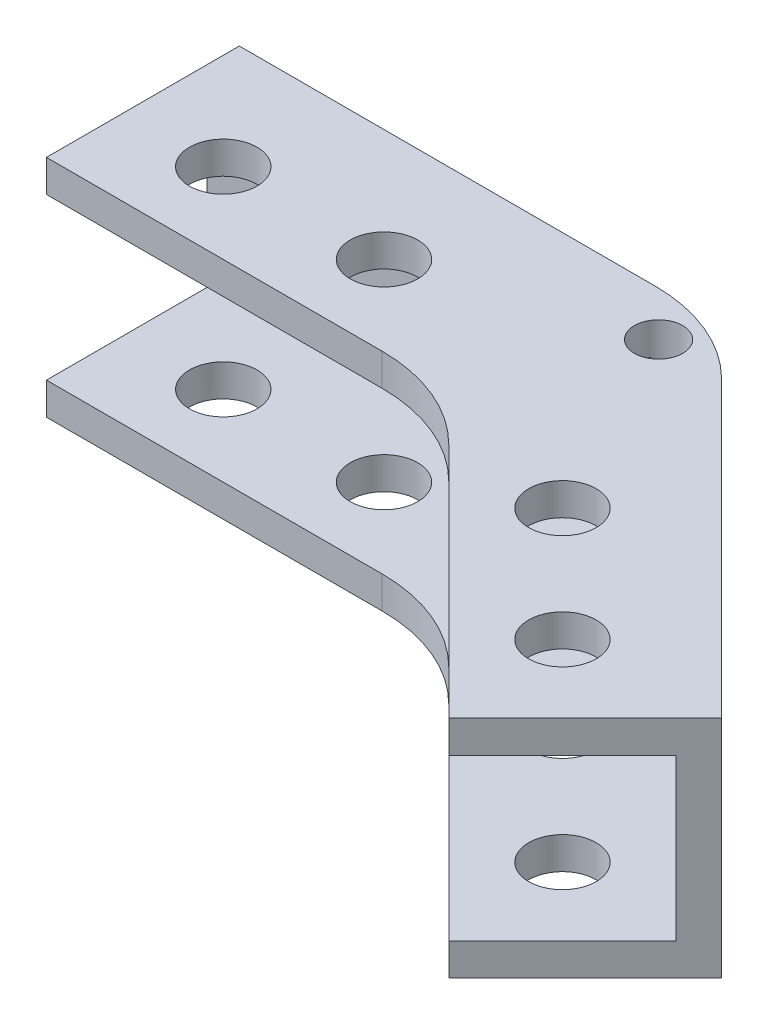
ISO-10303-21;
HEADER;
FILE_DESCRIPTION(('STEP AP214'),'2;1');
FILE_NAME('part.step','',(''),(''),'','','');
FILE_SCHEMA(('AUTOMOTIVE_DESIGN { 1 0 10303 214 1 1 1 1 }'));
ENDSEC;
DATA;
#1=APPLICATION_CONTEXT('core data for automotive mechanical design processes');
#2=APPLICATION_PROTOCOL_DEFINITION('international standard','automotive_design',2000,#1);
#3=PRODUCT_CONTEXT('',#1,'mechanical');
#4=PRODUCT('Part','Part','',(#3));
#5=PRODUCT_RELATED_PRODUCT_CATEGORY('part','',(#4));
#6=PRODUCT_DEFINITION_FORMATION('','',#4);
#7=PRODUCT_DEFINITION_CONTEXT('part definition',#1,'design');
#8=PRODUCT_DEFINITION('design','',#6,#7);
#9=PRODUCT_DEFINITION_SHAPE('','',#8);
#10=(LENGTH_UNIT() NAMED_UNIT(*) SI_UNIT(.MILLI.,.METRE.));
#11=(NAMED_UNIT(*) PLANE_ANGLE_UNIT() SI_UNIT($,.RADIAN.));
#12=(NAMED_UNIT(*) SI_UNIT($,.STERADIAN.) SOLID_ANGLE_UNIT());
#13=UNCERTAINTY_MEASURE_WITH_UNIT(LENGTH_MEASURE(1.E-05),#10,'distance_accuracy_value','');
#14=(GEOMETRIC_REPRESENTATION_CONTEXT(3) GLOBAL_UNCERTAINTY_ASSIGNED_CONTEXT((#13)) GLOBAL_UNIT_ASSIGNED_CONTEXT((#10,
#11,#12)) REPRESENTATION_CONTEXT('',''));
#15=CARTESIAN_POINT('',(0.,0.,0.));
#16=DIRECTION('',(0.,0.,1.));
#17=DIRECTION('',(1.,0.,0.));
#18=AXIS2_PLACEMENT_3D('',#15,#16,#17);
#19=CARTESIAN_POINT('',(1.66776755807594,-0.999999999999999,-7.22836140246614));
#20=DIRECTION('',(0.,1.,0.));
#21=DIRECTION('',(0.,0.,1.));
#22=AXIS2_PLACEMENT_3D('',#19,#20,#21);
#23=CYLINDRICAL_SURFACE('',#22,1.5);
#24=CARTESIAN_POINT('',(1.66776755807594,0.,-7.22836140246614));
#25=DIRECTION('',(0.,-1.,0.));
#26=DIRECTION('',(0.,0.,-1.));
#27=AXIS2_PLACEMENT_3D('',#24,#25,#26);
#28=CIRCLE('',#27,1.5);
#29=CARTESIAN_POINT('',(1.66776755807594,0.,-8.72836140246613));
#30=VERTEX_POINT('',#29);
#31=EDGE_CURVE('E297',#30,#30,#28,.T.);
#32=ORIENTED_EDGE('',*,*,#31,.T.);
#33=EDGE_LOOP('',(#32));
#34=FACE_BOUND('',#33,.T.);
#35=DIRECTION('',(0.,1.,0.));
#36=VECTOR('',#35,1.);
#37=CARTESIAN_POINT('',(3.12295159561377,-0.999999999999999,-6.86443913481123));
#38=LINE('',#37,#36);
#39=CARTESIAN_POINT('',(3.12295159561377,4.,-6.86443913481123));
#40=VERTEX_POINT('',#39);
#41=CARTESIAN_POINT('',(3.12295159561377,2.,-6.86443913481123));
#42=VERTEX_POINT('',#41);
#43=EDGE_CURVE('E283',#40,#42,#38,.F.);
#44=ORIENTED_EDGE('',*,*,#43,.F.);
#45=CARTESIAN_POINT('',(1.66776755807594,4.,-7.22836140246614));
#46=DIRECTION('',(0.,-1.,0.));
#47=DIRECTION('',(0.,0.,-1.));
#48=AXIS2_PLACEMENT_3D('',#45,#46,#47);
#49=CIRCLE('',#48,1.5);
#50=CARTESIAN_POINT('',(0.381465153974948,4.,-7.99999999999999));
#51=VERTEX_POINT('',#50);
#52=EDGE_CURVE('E482',#40,#51,#49,.F.);
#53=ORIENTED_EDGE('',*,*,#52,.T.);
#54=DIRECTION('',(0.,1.,0.));
#55=VECTOR('',#54,1.);
#56=CARTESIAN_POINT('',(0.381465153974948,-0.999999999999999,-7.99999999999999));
#57=LINE('',#56,#55);
#58=CARTESIAN_POINT('',(0.381465153974948,2.,-7.99999999999999));
#59=VERTEX_POINT('',#58);
#60=EDGE_CURVE('E289',#59,#51,#57,.T.);
#61=ORIENTED_EDGE('',*,*,#60,.F.);
#62=CARTESIAN_POINT('',(1.66776755807594,2.,-7.22836140246614));
#63=DIRECTION('',(0.,1.,0.));
#64=DIRECTION('',(0.,0.,1.));
#65=AXIS2_PLACEMENT_3D('',#62,#63,#64);
#66=CIRCLE('',#65,1.5);
#67=EDGE_CURVE('E466',#59,#42,#66,.T.);
#68=ORIENTED_EDGE('',*,*,#67,.T.);
#69=EDGE_LOOP('',(#44,#53,#61,#68));
#70=FACE_BOUND('',#69,.T.);
#71=ADVANCED_FACE('F46',(#34,#70),#23,.F.);
#72=CARTESIAN_POINT('',(1.98739073042501,14.,-7.99999999999999));
#73=DIRECTION('',(0.,0.,-1.));
#74=DIRECTION('',(-1.,0.,0.));
#75=AXIS2_PLACEMENT_3D('',#72,#73,#74);
#76=PLANE('',#75);
#77=DIRECTION('',(0.,1.,0.));
#78=VECTOR('',#77,1.);
#79=CARTESIAN_POINT('',(-4.18418214482879,14.,-7.99999999999999));
#80=LINE('',#79,#78);
#81=CARTESIAN_POINT('',(-4.18418214482879,4.,-7.99999999999999));
#82=VERTEX_POINT('',#81);
#83=CARTESIAN_POINT('',(-4.18418214482879,10.,-7.99999999999999));
#84=VERTEX_POINT('',#83);
#85=EDGE_CURVE('E275',#82,#84,#80,.T.);
#86=ORIENTED_EDGE('',*,*,#85,.T.);
#87=DIRECTION('',(1.,0.,0.));
#88=VECTOR('',#87,1.);
#89=CARTESIAN_POINT('',(1.98739073042501,10.,-7.99999999999999));
#90=LINE('',#89,#88);
#91=CARTESIAN_POINT('',(0.381465153974948,10.,-7.99999999999999));
#92=VERTEX_POINT('',#91);
#93=EDGE_CURVE('E271',#84,#92,#90,.T.);
#94=ORIENTED_EDGE('',*,*,#93,.T.);
#95=CARTESIAN_POINT('',(0.381465153974948,12.,-7.99999999999999));
#96=VERTEX_POINT('',#95);
#97=EDGE_CURVE('E288',#92,#96,#57,.T.);
#98=ORIENTED_EDGE('',*,*,#97,.T.);
#99=DIRECTION('',(-1.,0.,0.));
#100=VECTOR('',#99,1.);
#101=CARTESIAN_POINT('',(1.98739073042501,12.,-7.99999999999999));
#102=LINE('',#101,#100);
#103=CARTESIAN_POINT('',(-27.1841821448288,12.,-7.99999999999999));
#104=VERTEX_POINT('',#103);
#105=EDGE_CURVE('E391',#96,#104,#102,.T.);
#106=ORIENTED_EDGE('',*,*,#105,.T.);
#107=DIRECTION('',(0.,-1.,0.));
#108=VECTOR('',#107,1.);
#109=CARTESIAN_POINT('',(-27.1841821448288,14.,-7.99999999999999));
#110=LINE('',#109,#108);
#111=CARTESIAN_POINT('',(-27.1841821448288,2.,-7.99999999999999));
#112=VERTEX_POINT('',#111);
#113=EDGE_CURVE('E463',#104,#112,#110,.T.);
#114=ORIENTED_EDGE('',*,*,#113,.T.);
#115=DIRECTION('',(1.,0.,0.));
#116=VECTOR('',#115,1.);
#117=CARTESIAN_POINT('',(1.98739073042501,2.,-7.99999999999999));
#118=LINE('',#117,#116);
#119=EDGE_CURVE('E354',#112,#59,#118,.T.);
#120=ORIENTED_EDGE('',*,*,#119,.T.);
#121=ORIENTED_EDGE('',*,*,#60,.T.);
#122=DIRECTION('',(-1.,0.,0.));
#123=VECTOR('',#122,1.);
#124=CARTESIAN_POINT('',(1.98739073042501,4.,-7.99999999999999));
#125=LINE('',#124,#123);
#126=EDGE_CURVE('E264',#51,#82,#125,.T.);
#127=ORIENTED_EDGE('',*,*,#126,.T.);
#128=EDGE_LOOP('',(#86,#94,#98,#106,#114,#120,#121,#127));
#129=FACE_BOUND('',#128,.T.);
#130=ADVANCED_FACE('F563',(#129),#76,.F.);
#131=CARTESIAN_POINT('',(22.6148077283945,14.,12.6274169979696));
#132=DIRECTION('',(0.707106781186548,0.,-0.707106781186547));
#133=DIRECTION('',(-0.707106781186547,0.,-0.707106781186548));
#134=AXIS2_PLACEMENT_3D('',#131,#132,#133);
#135=PLANE('',#134);
#136=DIRECTION('',(0.,-1.,0.));
#137=VECTOR('',#136,1.);
#138=CARTESIAN_POINT('',(6.35135176110393,14.,-3.63603896932106));
#139=LINE('',#138,#137);
#140=CARTESIAN_POINT('',(6.35135176110393,10.,-3.63603896932106));
#141=VERTEX_POINT('',#140);
#142=CARTESIAN_POINT('',(6.35135176110393,4.,-3.63603896932106));
#143=VERTEX_POINT('',#142);
#144=EDGE_CURVE('E226',#141,#143,#139,.T.);
#145=ORIENTED_EDGE('',*,*,#144,.T.);
#146=DIRECTION('',(-0.707106781186547,0.,-0.707106781186548));
#147=VECTOR('',#146,1.);
#148=CARTESIAN_POINT('',(22.6148077283945,3.99999999999999,12.6274169979695));
#149=LINE('',#148,#147);
#150=EDGE_CURVE('E244',#143,#40,#149,.T.);
#151=ORIENTED_EDGE('',*,*,#150,.T.);
#152=ORIENTED_EDGE('',*,*,#43,.T.);
#153=DIRECTION('',(0.707106781186547,0.,0.707106781186548));
#154=VECTOR('',#153,1.);
#155=CARTESIAN_POINT('',(22.6148077283945,2.,12.6274169979696));
#156=LINE('',#155,#154);
#157=CARTESIAN_POINT('',(22.6148077283945,2.,12.6274169979696));
#158=VERTEX_POINT('',#157);
#159=EDGE_CURVE('E358',#42,#158,#156,.T.);
#160=ORIENTED_EDGE('',*,*,#159,.T.);
#161=DIRECTION('',(0.,-1.,0.));
#162=VECTOR('',#161,1.);
#163=CARTESIAN_POINT('',(22.6148077283945,14.,12.6274169979696));
#164=LINE('',#163,#162);
#165=CARTESIAN_POINT('',(22.6148077283945,12.,12.6274169979696));
#166=VERTEX_POINT('',#165);
#167=EDGE_CURVE('E459',#166,#158,#164,.T.);
#168=ORIENTED_EDGE('',*,*,#167,.F.);
#169=DIRECTION('',(-0.707106781186547,0.,-0.707106781186548));
#170=VECTOR('',#169,1.);
#171=CARTESIAN_POINT('',(22.6148077283945,12.,12.6274169979696));
#172=LINE('',#171,#170);
#173=CARTESIAN_POINT('',(3.12295159561377,12.,-6.86443913481123));
#174=VERTEX_POINT('',#173);
#175=EDGE_CURVE('E409',#166,#174,#172,.T.);
#176=ORIENTED_EDGE('',*,*,#175,.T.);
#177=CARTESIAN_POINT('',(3.12295159561377,10.,-6.86443913481123));
#178=VERTEX_POINT('',#177);
#179=EDGE_CURVE('E284',#174,#178,#38,.F.);
#180=ORIENTED_EDGE('',*,*,#179,.T.);
#181=DIRECTION('',(0.707106781186547,0.,0.707106781186548));
#182=VECTOR('',#181,1.);
#183=CARTESIAN_POINT('',(22.6148077283945,10.,12.6274169979696));
#184=LINE('',#183,#182);
#185=EDGE_CURVE('E240',#178,#141,#184,.T.);
#186=ORIENTED_EDGE('',*,*,#185,.T.);
#187=EDGE_LOOP('',(#145,#151,#152,#160,#168,#176,#180,#186));
#188=FACE_BOUND('',#187,.T.);
#189=ADVANCED_FACE('F536',(#188),#135,.F.);
#190=CARTESIAN_POINT('',(-27.1841821448288,14.,-7.99999999999999));
#191=DIRECTION('',(1.,0.,0.));
#192=DIRECTION('',(0.,0.,-1.));
#193=AXIS2_PLACEMENT_3D('',#190,#191,#192);
#194=PLANE('',#193);
#195=DIRECTION('',(0.,0.,1.));
#196=VECTOR('',#195,1.);
#197=CARTESIAN_POINT('',(-27.1841821448288,0.,-7.99999999999999));
#198=LINE('',#197,#196);
#199=CARTESIAN_POINT('',(-27.1841821448288,0.,-9.99999999999999));
#200=VERTEX_POINT('',#199);
#201=CARTESIAN_POINT('',(-27.1841821448288,0.,2.00000000000001));
#202=VERTEX_POINT('',#201);
#203=EDGE_CURVE('E422',#200,#202,#198,.T.);
#204=ORIENTED_EDGE('',*,*,#203,.T.);
#205=DIRECTION('',(0.,-1.,0.));
#206=VECTOR('',#205,1.);
#207=CARTESIAN_POINT('',(-27.1841821448288,2.,2.00000000000001));
#208=LINE('',#207,#206);
#209=CARTESIAN_POINT('',(-27.1841821448288,2.,2.00000000000001));
#210=VERTEX_POINT('',#209);
#211=EDGE_CURVE('E383',#210,#202,#208,.T.);
#212=ORIENTED_EDGE('',*,*,#211,.F.);
#213=DIRECTION('',(0.,0.,-1.));
#214=VECTOR('',#213,1.);
#215=CARTESIAN_POINT('',(-27.1841821448288,2.,-7.99999999999999));
#216=LINE('',#215,#214);
#217=EDGE_CURVE('E373',#210,#112,#216,.T.);
#218=ORIENTED_EDGE('',*,*,#217,.T.);
#219=ORIENTED_EDGE('',*,*,#113,.F.);
#220=DIRECTION('',(0.,0.,1.));
#221=VECTOR('',#220,1.);
#222=CARTESIAN_POINT('',(-27.1841821448288,12.,-7.99999999999999));
#223=LINE('',#222,#221);
#224=CARTESIAN_POINT('',(-27.1841821448288,12.,2.00000000000001));
#225=VERTEX_POINT('',#224);
#226=EDGE_CURVE('E394',#104,#225,#223,.T.);
#227=ORIENTED_EDGE('',*,*,#226,.T.);
#228=DIRECTION('',(0.,1.,0.));
#229=VECTOR('',#228,1.);
#230=CARTESIAN_POINT('',(-27.1841821448288,12.,2.00000000000001));
#231=LINE('',#230,#229);
#232=CARTESIAN_POINT('',(-27.1841821448288,14.,2.00000000000001));
#233=VERTEX_POINT('',#232);
#234=EDGE_CURVE('E413',#225,#233,#231,.T.);
#235=ORIENTED_EDGE('',*,*,#234,.T.);
#236=DIRECTION('',(0.,0.,1.));
#237=VECTOR('',#236,1.);
#238=CARTESIAN_POINT('',(-27.1841821448288,14.,-7.99999999999999));
#239=LINE('',#238,#237);
#240=CARTESIAN_POINT('',(-27.1841821448288,14.,-9.99999999999999));
#241=VERTEX_POINT('',#240);
#242=EDGE_CURVE('E426',#241,#233,#239,.T.);
#243=ORIENTED_EDGE('',*,*,#242,.F.);
#244=DIRECTION('',(0.,-1.,0.));
#245=VECTOR('',#244,1.);
#246=CARTESIAN_POINT('',(-27.1841821448288,14.,-9.99999999999999));
#247=LINE('',#246,#245);
#248=EDGE_CURVE('E440',#241,#200,#247,.T.);
#249=ORIENTED_EDGE('',*,*,#248,.T.);
#250=EDGE_LOOP('',(#204,#212,#218,#219,#227,#235,#243,#249));
#251=FACE_BOUND('',#250,.T.);
#252=ADVANCED_FACE('F603',(#251),#194,.F.);
#253=CARTESIAN_POINT('',(24.0290212907676,14.,11.2132034355965));
#254=DIRECTION('',(-0.707106781186546,0.,-0.707106781186549));
#255=DIRECTION('',(-0.707106781186549,0.,0.707106781186546));
#256=AXIS2_PLACEMENT_3D('',#253,#254,#255);
#257=PLANE('',#256);
#258=DIRECTION('',(0.707106781186549,0.,-0.707106781186546));
#259=VECTOR('',#258,1.);
#260=CARTESIAN_POINT('',(24.0290212907676,0.,11.2132034355965));
#261=LINE('',#260,#259);
#262=CARTESIAN_POINT('',(15.543739916529,0.,19.698484809835));
#263=VERTEX_POINT('',#262);
#264=CARTESIAN_POINT('',(24.0290212907676,0.,11.2132034355965));
#265=VERTEX_POINT('',#264);
#266=EDGE_CURVE('E444',#263,#265,#261,.T.);
#267=ORIENTED_EDGE('',*,*,#266,.T.);
#268=DIRECTION('',(0.,-1.,0.));
#269=VECTOR('',#268,1.);
#270=CARTESIAN_POINT('',(24.0290212907676,14.,11.2132034355965));
#271=LINE('',#270,#269);
#272=CARTESIAN_POINT('',(24.0290212907676,14.,11.2132034355965));
#273=VERTEX_POINT('',#272);
#274=EDGE_CURVE('E455',#273,#265,#271,.T.);
#275=ORIENTED_EDGE('',*,*,#274,.F.);
#276=DIRECTION('',(0.707106781186549,0.,-0.707106781186546));
#277=VECTOR('',#276,1.);
#278=CARTESIAN_POINT('',(24.0290212907676,14.,11.2132034355965));
#279=LINE('',#278,#277);
#280=CARTESIAN_POINT('',(15.543739916529,14.,19.698484809835));
#281=VERTEX_POINT('',#280);
#282=EDGE_CURVE('E429',#281,#273,#279,.T.);
#283=ORIENTED_EDGE('',*,*,#282,.F.);
#284=DIRECTION('',(0.,1.,0.));
#285=VECTOR('',#284,1.);
#286=CARTESIAN_POINT('',(15.543739916529,12.,19.698484809835));
#287=LINE('',#286,#285);
#288=CARTESIAN_POINT('',(15.543739916529,12.,19.698484809835));
#289=VERTEX_POINT('',#288);
#290=EDGE_CURVE('E418',#289,#281,#287,.T.);
#291=ORIENTED_EDGE('',*,*,#290,.F.);
#292=DIRECTION('',(0.707106781186548,0.,-0.707106781186547));
#293=VECTOR('',#292,1.);
#294=CARTESIAN_POINT('',(15.543739916529,12.,19.698484809835));
#295=LINE('',#294,#293);
#296=EDGE_CURVE('E406',#289,#166,#295,.T.);
#297=ORIENTED_EDGE('',*,*,#296,.T.);
#298=ORIENTED_EDGE('',*,*,#167,.T.);
#299=DIRECTION('',(-0.707106781186548,0.,0.707106781186547));
#300=VECTOR('',#299,1.);
#301=CARTESIAN_POINT('',(15.543739916529,2.,19.698484809835));
#302=LINE('',#301,#300);
#303=CARTESIAN_POINT('',(15.543739916529,2.,19.698484809835));
#304=VERTEX_POINT('',#303);
#305=EDGE_CURVE('E362',#158,#304,#302,.T.);
#306=ORIENTED_EDGE('',*,*,#305,.T.);
#307=DIRECTION('',(0.,-1.,0.));
#308=VECTOR('',#307,1.);
#309=CARTESIAN_POINT('',(15.543739916529,2.,19.698484809835));
#310=LINE('',#309,#308);
#311=EDGE_CURVE('E377',#304,#263,#310,.T.);
#312=ORIENTED_EDGE('',*,*,#311,.T.);
#313=EDGE_LOOP('',(#267,#275,#283,#291,#297,#298,#306,#312));
#314=FACE_BOUND('',#313,.T.);
#315=ADVANCED_FACE('F548',(#314),#257,.F.);
#316=CARTESIAN_POINT('',(2.81581785517121,14.,-9.99999999999999));
#317=DIRECTION('',(-0.707106781186549,0.,0.707106781186547));
#318=DIRECTION('',(0.707106781186546,0.,0.707106781186549));
#319=AXIS2_PLACEMENT_3D('',#316,#317,#318);
#320=PLANE('',#319);
#321=DIRECTION('',(-0.707106781186546,0.,-0.707106781186549));
#322=VECTOR('',#321,1.);
#323=CARTESIAN_POINT('',(2.81581785517121,0.,-9.99999999999999));
#324=LINE('',#323,#322);
#325=CARTESIAN_POINT('',(5.74475004330574,0.,-7.07106781186546));
#326=VERTEX_POINT('',#325);
#327=EDGE_CURVE('E447',#265,#326,#324,.T.);
#328=ORIENTED_EDGE('',*,*,#327,.T.);
#329=DIRECTION('',(0.,-1.,0.));
#330=VECTOR('',#329,1.);
#331=CARTESIAN_POINT('',(5.74475004330574,14.,-7.07106781186546));
#332=LINE('',#331,#330);
#333=CARTESIAN_POINT('',(5.74475004330574,4.,-7.07106781186546));
#334=VERTEX_POINT('',#333);
#335=EDGE_CURVE('E502',#326,#334,#332,.F.);
#336=ORIENTED_EDGE('',*,*,#335,.T.);
#337=DIRECTION('',(-0.707106781186547,0.,-0.707106781186549));
#338=VECTOR('',#337,1.);
#339=CARTESIAN_POINT('',(2.81581785517121,4.,-9.99999999999999));
#340=LINE('',#339,#338);
#341=CARTESIAN_POINT('',(7.76556532347703,4.,-5.05025253169415));
#342=VERTEX_POINT('',#341);
#343=EDGE_CURVE('E229',#342,#334,#340,.T.);
#344=ORIENTED_EDGE('',*,*,#343,.F.);
#345=DIRECTION('',(0.,-1.,0.));
#346=VECTOR('',#345,1.);
#347=CARTESIAN_POINT('',(7.76556532347703,10.,-5.05025253169415));
#348=LINE('',#347,#346);
#349=CARTESIAN_POINT('',(7.76556532347703,10.,-5.05025253169415));
#350=VERTEX_POINT('',#349);
#351=EDGE_CURVE('E218',#350,#342,#348,.T.);
#352=ORIENTED_EDGE('',*,*,#351,.F.);
#353=DIRECTION('',(0.707106781186547,0.,0.707106781186549));
#354=VECTOR('',#353,1.);
#355=CARTESIAN_POINT('',(2.81581785517121,10.,-9.99999999999999));
#356=LINE('',#355,#354);
#357=CARTESIAN_POINT('',(5.74475004330574,10.,-7.07106781186546));
#358=VERTEX_POINT('',#357);
#359=EDGE_CURVE('E206',#358,#350,#356,.T.);
#360=ORIENTED_EDGE('',*,*,#359,.F.);
#361=DIRECTION('',(0.,-1.,0.));
#362=VECTOR('',#361,1.);
#363=CARTESIAN_POINT('',(5.74475004330574,14.,-7.07106781186546));
#364=LINE('',#363,#362);
#365=CARTESIAN_POINT('',(5.74475004330574,14.,-7.07106781186546));
#366=VERTEX_POINT('',#365);
#367=EDGE_CURVE('E499',#358,#366,#364,.F.);
#368=ORIENTED_EDGE('',*,*,#367,.T.);
#369=DIRECTION('',(-0.707106781186546,0.,-0.707106781186549));
#370=VECTOR('',#369,1.);
#371=CARTESIAN_POINT('',(2.81581785517121,14.,-9.99999999999999));
#372=LINE('',#371,#370);
#373=EDGE_CURVE('E433',#273,#366,#372,.T.);
#374=ORIENTED_EDGE('',*,*,#373,.F.);
#375=ORIENTED_EDGE('',*,*,#274,.T.);
#376=EDGE_LOOP('',(#328,#336,#344,#352,#360,#368,#374,#375));
#377=FACE_BOUND('',#376,.T.);
#378=ADVANCED_FACE('F232',(#377),#320,.F.);
#379=CARTESIAN_POINT('',(-27.1841821448288,14.,-9.99999999999999));
#380=DIRECTION('',(0.,0.,1.));
#381=DIRECTION('',(1.,0.,0.));
#382=AXIS2_PLACEMENT_3D('',#379,#380,#381);
#383=PLANE('',#382);
#384=DIRECTION('',(-1.,0.,0.));
#385=VECTOR('',#384,1.);
#386=CARTESIAN_POINT('',(2.81581785517121,4.,-9.99999999999999));
#387=LINE('',#386,#385);
#388=CARTESIAN_POINT('',(-1.32631776855975,4.,-9.99999999999999));
#389=VERTEX_POINT('',#388);
#390=CARTESIAN_POINT('',(-4.18418214482879,4.,-9.99999999999999));
#391=VERTEX_POINT('',#390);
#392=EDGE_CURVE('E250',#389,#391,#387,.T.);
#393=ORIENTED_EDGE('',*,*,#392,.F.);
#394=DIRECTION('',(0.,-1.,0.));
#395=VECTOR('',#394,1.);
#396=CARTESIAN_POINT('',(-1.32631776855975,14.,-9.99999999999999));
#397=LINE('',#396,#395);
#398=CARTESIAN_POINT('',(-1.32631776855975,0.,-9.99999999999999));
#399=VERTEX_POINT('',#398);
#400=EDGE_CURVE('E492',#389,#399,#397,.T.);
#401=ORIENTED_EDGE('',*,*,#400,.T.);
#402=DIRECTION('',(-1.,0.,0.));
#403=VECTOR('',#402,1.);
#404=CARTESIAN_POINT('',(-27.1841821448288,0.,-9.99999999999999));
#405=LINE('',#404,#403);
#406=EDGE_CURVE('E430',#399,#200,#405,.T.);
#407=ORIENTED_EDGE('',*,*,#406,.T.);
#408=ORIENTED_EDGE('',*,*,#248,.F.);
#409=DIRECTION('',(-1.,0.,0.));
#410=VECTOR('',#409,1.);
#411=CARTESIAN_POINT('',(-27.1841821448288,14.,-9.99999999999999));
#412=LINE('',#411,#410);
#413=CARTESIAN_POINT('',(-1.32631776855975,14.,-9.99999999999999));
#414=VERTEX_POINT('',#413);
#415=EDGE_CURVE('E437',#414,#241,#412,.T.);
#416=ORIENTED_EDGE('',*,*,#415,.F.);
#417=DIRECTION('',(0.,-1.,0.));
#418=VECTOR('',#417,1.);
#419=CARTESIAN_POINT('',(-1.32631776855975,14.,-9.99999999999999));
#420=LINE('',#419,#418);
#421=CARTESIAN_POINT('',(-1.32631776855975,10.,-9.99999999999999));
#422=VERTEX_POINT('',#421);
#423=EDGE_CURVE('E488',#414,#422,#420,.T.);
#424=ORIENTED_EDGE('',*,*,#423,.T.);
#425=DIRECTION('',(1.,0.,0.));
#426=VECTOR('',#425,1.);
#427=CARTESIAN_POINT('',(2.81581785517121,10.,-9.99999999999999));
#428=LINE('',#427,#426);
#429=CARTESIAN_POINT('',(-4.18418214482879,10.,-9.99999999999999));
#430=VERTEX_POINT('',#429);
#431=EDGE_CURVE('E257',#430,#422,#428,.T.);
#432=ORIENTED_EDGE('',*,*,#431,.F.);
#433=DIRECTION('',(0.,1.,0.));
#434=VECTOR('',#433,1.);
#435=CARTESIAN_POINT('',(-4.18418214482879,10.,-9.99999999999999));
#436=LINE('',#435,#434);
#437=EDGE_CURVE('E253',#391,#430,#436,.T.);
#438=ORIENTED_EDGE('',*,*,#437,.F.);
#439=EDGE_LOOP('',(#393,#401,#407,#408,#416,#424,#432,#438));
#440=FACE_BOUND('',#439,.T.);
#441=ADVANCED_FACE('F575',(#440),#383,.F.);
#442=CARTESIAN_POINT('',(0.,14.,0.));
#443=DIRECTION('',(0.,-1.,0.));
#444=DIRECTION('',(0.,0.,-1.));
#445=AXIS2_PLACEMENT_3D('',#442,#443,#444);
#446=PLANE('',#445);
#447=CARTESIAN_POINT('',(1.66776755807594,14.,-7.22836140246614));
#448=DIRECTION('',(0.,1.,0.));
#449=DIRECTION('',(0.,0.,1.));
#450=AXIS2_PLACEMENT_3D('',#447,#448,#449);
#451=CIRCLE('',#450,1.5);
#452=CARTESIAN_POINT('',(1.66776755807594,14.,-5.72836140246614));
#453=VERTEX_POINT('',#452);
#454=EDGE_CURVE('E279',#453,#453,#451,.T.);
#455=ORIENTED_EDGE('',*,*,#454,.F.);
#456=EDGE_LOOP('',(#455));
#457=FACE_BOUND('',#456,.T.);
#458=CARTESIAN_POINT('',(-21.1841821448288,14.,-2.99999999999999));
#459=DIRECTION('',(0.,1.,0.));
#460=DIRECTION('',(0.,0.,1.));
#461=AXIS2_PLACEMENT_3D('',#458,#459,#460);
#462=CIRCLE('',#461,2.1);
#463=CARTESIAN_POINT('',(-21.1841821448288,14.,-0.899999999999994));
#464=VERTEX_POINT('',#463);
#465=EDGE_CURVE('E302',#464,#464,#462,.T.);
#466=ORIENTED_EDGE('',*,*,#465,.F.);
#467=EDGE_LOOP('',(#466));
#468=FACE_BOUND('',#467,.T.);
#469=CARTESIAN_POINT('',(-11.1841821448288,14.,-2.99999999999999));
#470=DIRECTION('',(0.,1.,0.));
#471=DIRECTION('',(0.,0.,1.));
#472=AXIS2_PLACEMENT_3D('',#469,#470,#471);
#473=CIRCLE('',#472,2.1);
#474=CARTESIAN_POINT('',(-11.1841821448288,14.,-0.899999999999994));
#475=VERTEX_POINT('',#474);
#476=EDGE_CURVE('E307',#475,#475,#473,.T.);
#477=ORIENTED_EDGE('',*,*,#476,.F.);
#478=EDGE_LOOP('',(#477));
#479=FACE_BOUND('',#478,.T.);
#480=CARTESIAN_POINT('',(7.765565323477,14.,4.84924240491752));
#481=DIRECTION('',(0.,1.,0.));
#482=DIRECTION('',(0.,0.,1.));
#483=AXIS2_PLACEMENT_3D('',#480,#481,#482);
#484=CIRCLE('',#483,2.1);
#485=CARTESIAN_POINT('',(7.765565323477,14.,6.94924240491752));
#486=VERTEX_POINT('',#485);
#487=EDGE_CURVE('E311',#486,#486,#484,.T.);
#488=ORIENTED_EDGE('',*,*,#487,.F.);
#489=EDGE_LOOP('',(#488));
#490=FACE_BOUND('',#489,.T.);
#491=CARTESIAN_POINT('',(14.8366331353425,14.,11.920310216783));
#492=DIRECTION('',(0.,1.,0.));
#493=DIRECTION('',(0.,0.,1.));
#494=AXIS2_PLACEMENT_3D('',#491,#492,#493);
#495=CIRCLE('',#494,2.1);
#496=CARTESIAN_POINT('',(14.8366331353425,14.,14.020310216783));
#497=VERTEX_POINT('',#496);
#498=EDGE_CURVE('E301',#497,#497,#495,.T.);
#499=ORIENTED_EDGE('',*,*,#498,.F.);
#500=EDGE_LOOP('',(#499));
#501=FACE_BOUND('',#500,.T.);
#502=ORIENTED_EDGE('',*,*,#373,.T.);
#503=CARTESIAN_POINT('',(-1.32631776855975,14.,0.));
#504=DIRECTION('',(0.,-1.,0.));
#505=DIRECTION('',(0.,0.,-1.));
#506=AXIS2_PLACEMENT_3D('',#503,#504,#505);
#507=CIRCLE('',#506,10.);
#508=EDGE_CURVE('E510',#366,#414,#507,.F.);
#509=ORIENTED_EDGE('',*,*,#508,.T.);
#510=ORIENTED_EDGE('',*,*,#415,.T.);
#511=ORIENTED_EDGE('',*,*,#242,.T.);
#512=DIRECTION('',(1.,0.,0.));
#513=VECTOR('',#512,1.);
#514=CARTESIAN_POINT('',(-27.1841821448288,14.,2.00000000000001));
#515=LINE('',#514,#513);
#516=CARTESIAN_POINT('',(-6.2968805170369,14.,2.00000000000001));
#517=VERTEX_POINT('',#516);
#518=EDGE_CURVE('E387',#233,#517,#515,.T.);
#519=ORIENTED_EDGE('',*,*,#518,.T.);
#520=CARTESIAN_POINT('',(-6.2968805170369,14.,12.));
#521=DIRECTION('',(0.,-1.,0.));
#522=DIRECTION('',(0.,0.,-1.));
#523=AXIS2_PLACEMENT_3D('',#520,#521,#522);
#524=CIRCLE('',#523,10.);
#525=CARTESIAN_POINT('',(0.77418729482858,14.,4.92893218813454));
#526=VERTEX_POINT('',#525);
#527=EDGE_CURVE('E55',#517,#526,#524,.T.);
#528=ORIENTED_EDGE('',*,*,#527,.T.);
#529=DIRECTION('',(0.707106781186547,0.,0.707106781186548));
#530=VECTOR('',#529,1.);
#531=CARTESIAN_POINT('',(-2.15474489330595,14.,2.00000000000001));
#532=LINE('',#531,#530);
#533=EDGE_CURVE('E395',#526,#281,#532,.T.);
#534=ORIENTED_EDGE('',*,*,#533,.T.);
#535=ORIENTED_EDGE('',*,*,#282,.T.);
#536=EDGE_LOOP('',(#502,#509,#510,#511,#519,#528,#534,#535));
#537=FACE_BOUND('',#536,.T.);
#538=ADVANCED_FACE('F611',(#457,#468,#479,#490,#501,#537),#446,.F.);
#539=CARTESIAN_POINT('',(0.,0.,0.));
#540=DIRECTION('',(0.,-1.,0.));
#541=DIRECTION('',(0.,0.,-1.));
#542=AXIS2_PLACEMENT_3D('',#539,#540,#541);
#543=PLANE('',#542);
#544=ORIENTED_EDGE('',*,*,#31,.F.);
#545=EDGE_LOOP('',(#544));
#546=FACE_BOUND('',#545,.T.);
#547=CARTESIAN_POINT('',(-21.1841821448288,0.,-2.99999999999999));
#548=DIRECTION('',(0.,-1.,0.));
#549=DIRECTION('',(0.,0.,-1.));
#550=AXIS2_PLACEMENT_3D('',#547,#548,#549);
#551=CIRCLE('',#550,2.1);
#552=CARTESIAN_POINT('',(-21.1841821448288,0.,-5.1));
#553=VERTEX_POINT('',#552);
#554=EDGE_CURVE('E349',#553,#553,#551,.T.);
#555=ORIENTED_EDGE('',*,*,#554,.F.);
#556=EDGE_LOOP('',(#555));
#557=FACE_BOUND('',#556,.T.);
#558=CARTESIAN_POINT('',(-11.1841821448288,0.,-2.99999999999999));
#559=DIRECTION('',(0.,-1.,0.));
#560=DIRECTION('',(0.,0.,-1.));
#561=AXIS2_PLACEMENT_3D('',#558,#559,#560);
#562=CIRCLE('',#561,2.1);
#563=CARTESIAN_POINT('',(-11.1841821448288,0.,-5.1));
#564=VERTEX_POINT('',#563);
#565=EDGE_CURVE('E340',#564,#564,#562,.T.);
#566=ORIENTED_EDGE('',*,*,#565,.F.);
#567=EDGE_LOOP('',(#566));
#568=FACE_BOUND('',#567,.T.);
#569=CARTESIAN_POINT('',(7.765565323477,0.,4.84924240491752));
#570=DIRECTION('',(0.,-1.,0.));
#571=DIRECTION('',(0.,0.,-1.));
#572=AXIS2_PLACEMENT_3D('',#569,#570,#571);
#573=CIRCLE('',#572,2.1);
#574=CARTESIAN_POINT('',(7.765565323477,0.,2.74924240491752));
#575=VERTEX_POINT('',#574);
#576=EDGE_CURVE('E331',#575,#575,#573,.T.);
#577=ORIENTED_EDGE('',*,*,#576,.F.);
#578=EDGE_LOOP('',(#577));
#579=FACE_BOUND('',#578,.T.);
#580=CARTESIAN_POINT('',(14.8366331353425,0.,11.920310216783));
#581=DIRECTION('',(0.,-1.,0.));
#582=DIRECTION('',(0.,0.,-1.));
#583=AXIS2_PLACEMENT_3D('',#580,#581,#582);
#584=CIRCLE('',#583,2.1);
#585=CARTESIAN_POINT('',(14.8366331353425,0.,9.820310216783));
#586=VERTEX_POINT('',#585);
#587=EDGE_CURVE('E322',#586,#586,#584,.T.);
#588=ORIENTED_EDGE('',*,*,#587,.F.);
#589=EDGE_LOOP('',(#588));
#590=FACE_BOUND('',#589,.T.);
#591=ORIENTED_EDGE('',*,*,#406,.F.);
#592=CARTESIAN_POINT('',(-1.32631776855975,0.,0.));
#593=DIRECTION('',(0.,-1.,0.));
#594=DIRECTION('',(0.,0.,-1.));
#595=AXIS2_PLACEMENT_3D('',#592,#593,#594);
#596=CIRCLE('',#595,10.);
#597=EDGE_CURVE('E496',#399,#326,#596,.T.);
#598=ORIENTED_EDGE('',*,*,#597,.T.);
#599=ORIENTED_EDGE('',*,*,#327,.F.);
#600=ORIENTED_EDGE('',*,*,#266,.F.);
#601=DIRECTION('',(-0.707106781186547,0.,-0.707106781186548));
#602=VECTOR('',#601,1.);
#603=CARTESIAN_POINT('',(-2.15474489330595,0.,2.00000000000001));
#604=LINE('',#603,#602);
#605=CARTESIAN_POINT('',(0.77418729482858,0.,4.92893218813454));
#606=VERTEX_POINT('',#605);
#607=EDGE_CURVE('E353',#263,#606,#604,.T.);
#608=ORIENTED_EDGE('',*,*,#607,.T.);
#609=CARTESIAN_POINT('',(-6.2968805170369,0.,12.));
#610=DIRECTION('',(0.,-1.,0.));
#611=DIRECTION('',(0.,0.,-1.));
#612=AXIS2_PLACEMENT_3D('',#609,#610,#611);
#613=CIRCLE('',#612,10.);
#614=CARTESIAN_POINT('',(-6.2968805170369,0.,2.00000000000001));
#615=VERTEX_POINT('',#614);
#616=EDGE_CURVE('E526',#606,#615,#613,.F.);
#617=ORIENTED_EDGE('',*,*,#616,.T.);
#618=DIRECTION('',(-1.,0.,0.));
#619=VECTOR('',#618,1.);
#620=CARTESIAN_POINT('',(-27.1841821448288,0.,2.00000000000001));
#621=LINE('',#620,#619);
#622=EDGE_CURVE('E359',#615,#202,#621,.T.);
#623=ORIENTED_EDGE('',*,*,#622,.T.);
#624=ORIENTED_EDGE('',*,*,#203,.F.);
#625=EDGE_LOOP('',(#591,#598,#599,#600,#608,#617,#623,#624));
#626=FACE_BOUND('',#625,.T.);
#627=ADVANCED_FACE('F583',(#546,#557,#568,#579,#590,#626),#543,.T.);
#628=CARTESIAN_POINT('',(-2.15474489330595,12.,2.00000000000001));
#629=DIRECTION('',(-0.707106781186548,0.,0.707106781186547));
#630=DIRECTION('',(0.707106781186547,0.,0.707106781186548));
#631=AXIS2_PLACEMENT_3D('',#628,#629,#630);
#632=PLANE('',#631);
#633=ORIENTED_EDGE('',*,*,#533,.F.);
#634=DIRECTION('',(0.,1.,0.));
#635=VECTOR('',#634,1.);
#636=CARTESIAN_POINT('',(0.77418729482858,12.,4.92893218813454));
#637=LINE('',#636,#635);
#638=CARTESIAN_POINT('',(0.77418729482858,12.,4.92893218813454));
#639=VERTEX_POINT('',#638);
#640=EDGE_CURVE('E62',#526,#639,#637,.F.);
#641=ORIENTED_EDGE('',*,*,#640,.T.);
#642=DIRECTION('',(0.707106781186547,0.,0.707106781186548));
#643=VECTOR('',#642,1.);
#644=CARTESIAN_POINT('',(-2.15474489330595,12.,2.00000000000001));
#645=LINE('',#644,#643);
#646=EDGE_CURVE('E403',#639,#289,#645,.T.);
#647=ORIENTED_EDGE('',*,*,#646,.T.);
#648=ORIENTED_EDGE('',*,*,#290,.T.);
#649=EDGE_LOOP('',(#633,#641,#647,#648));
#650=FACE_BOUND('',#649,.T.);
#651=ADVANCED_FACE('F612',(#650),#632,.T.);
#652=CARTESIAN_POINT('',(-27.1841821448288,12.,2.00000000000001));
#653=DIRECTION('',(0.,0.,1.));
#654=DIRECTION('',(1.,0.,0.));
#655=AXIS2_PLACEMENT_3D('',#652,#653,#654);
#656=PLANE('',#655);
#657=DIRECTION('',(1.,0.,0.));
#658=VECTOR('',#657,1.);
#659=CARTESIAN_POINT('',(-27.1841821448288,12.,2.00000000000001));
#660=LINE('',#659,#658);
#661=CARTESIAN_POINT('',(-6.2968805170369,12.,2.00000000000001));
#662=VERTEX_POINT('',#661);
#663=EDGE_CURVE('E399',#225,#662,#660,.T.);
#664=ORIENTED_EDGE('',*,*,#663,.T.);
#665=DIRECTION('',(0.,1.,0.));
#666=VECTOR('',#665,1.);
#667=CARTESIAN_POINT('',(-6.2968805170369,14.,2.00000000000001));
#668=LINE('',#667,#666);
#669=EDGE_CURVE('E520',#662,#517,#668,.T.);
#670=ORIENTED_EDGE('',*,*,#669,.T.);
#671=ORIENTED_EDGE('',*,*,#518,.F.);
#672=ORIENTED_EDGE('',*,*,#234,.F.);
#673=EDGE_LOOP('',(#664,#670,#671,#672));
#674=FACE_BOUND('',#673,.T.);
#675=ADVANCED_FACE('F618',(#674),#656,.T.);
#676=CARTESIAN_POINT('',(0.,12.,0.));
#677=DIRECTION('',(0.,1.,0.));
#678=DIRECTION('',(0.,0.,1.));
#679=AXIS2_PLACEMENT_3D('',#676,#677,#678);
#680=PLANE('',#679);
#681=CARTESIAN_POINT('',(-21.1841821448288,12.,-2.99999999999999));
#682=DIRECTION('',(0.,1.,0.));
#683=DIRECTION('',(0.,0.,1.));
#684=AXIS2_PLACEMENT_3D('',#681,#682,#683);
#685=CIRCLE('',#684,2.1);
#686=CARTESIAN_POINT('',(-21.1841821448288,12.,-0.899999999999994));
#687=VERTEX_POINT('',#686);
#688=EDGE_CURVE('E345',#687,#687,#685,.T.);
#689=ORIENTED_EDGE('',*,*,#688,.T.);
#690=EDGE_LOOP('',(#689));
#691=FACE_BOUND('',#690,.T.);
#692=CARTESIAN_POINT('',(-11.1841821448288,12.,-2.99999999999999));
#693=DIRECTION('',(0.,1.,0.));
#694=DIRECTION('',(0.,0.,1.));
#695=AXIS2_PLACEMENT_3D('',#692,#693,#694);
#696=CIRCLE('',#695,2.1);
#697=CARTESIAN_POINT('',(-11.1841821448288,12.,-0.899999999999994));
#698=VERTEX_POINT('',#697);
#699=EDGE_CURVE('E336',#698,#698,#696,.T.);
#700=ORIENTED_EDGE('',*,*,#699,.T.);
#701=EDGE_LOOP('',(#700));
#702=FACE_BOUND('',#701,.T.);
#703=CARTESIAN_POINT('',(7.765565323477,12.,4.84924240491752));
#704=DIRECTION('',(0.,1.,0.));
#705=DIRECTION('',(0.,0.,1.));
#706=AXIS2_PLACEMENT_3D('',#703,#704,#705);
#707=CIRCLE('',#706,2.1);
#708=CARTESIAN_POINT('',(7.765565323477,12.,6.94924240491752));
#709=VERTEX_POINT('',#708);
#710=EDGE_CURVE('E327',#709,#709,#707,.T.);
#711=ORIENTED_EDGE('',*,*,#710,.T.);
#712=EDGE_LOOP('',(#711));
#713=FACE_BOUND('',#712,.T.);
#714=CARTESIAN_POINT('',(14.8366331353425,12.,11.920310216783));
#715=DIRECTION('',(0.,1.,0.));
#716=DIRECTION('',(0.,0.,1.));
#717=AXIS2_PLACEMENT_3D('',#714,#715,#716);
#718=CIRCLE('',#717,2.1);
#719=CARTESIAN_POINT('',(14.8366331353425,12.,14.020310216783));
#720=VERTEX_POINT('',#719);
#721=EDGE_CURVE('E318',#720,#720,#718,.T.);
#722=ORIENTED_EDGE('',*,*,#721,.T.);
#723=EDGE_LOOP('',(#722));
#724=FACE_BOUND('',#723,.T.);
#725=ORIENTED_EDGE('',*,*,#105,.F.);
#726=CARTESIAN_POINT('',(1.66776755807594,12.,-7.22836140246614));
#727=DIRECTION('',(0.,1.,0.));
#728=DIRECTION('',(0.,0.,1.));
#729=AXIS2_PLACEMENT_3D('',#726,#727,#728);
#730=CIRCLE('',#729,1.5);
#731=EDGE_CURVE('E293',#96,#174,#730,.T.);
#732=ORIENTED_EDGE('',*,*,#731,.T.);
#733=ORIENTED_EDGE('',*,*,#175,.F.);
#734=ORIENTED_EDGE('',*,*,#296,.F.);
#735=ORIENTED_EDGE('',*,*,#646,.F.);
#736=CARTESIAN_POINT('',(-6.2968805170369,12.,12.));
#737=DIRECTION('',(0.,1.,0.));
#738=DIRECTION('',(0.,0.,1.));
#739=AXIS2_PLACEMENT_3D('',#736,#737,#738);
#740=CIRCLE('',#739,10.);
#741=EDGE_CURVE('E11',#639,#662,#740,.T.);
#742=ORIENTED_EDGE('',*,*,#741,.T.);
#743=ORIENTED_EDGE('',*,*,#663,.F.);
#744=ORIENTED_EDGE('',*,*,#226,.F.);
#745=EDGE_LOOP('',(#725,#732,#733,#734,#735,#742,#743,#744));
#746=FACE_BOUND('',#745,.T.);
#747=ADVANCED_FACE('F555',(#691,#702,#713,#724,#746),#680,.F.);
#748=CARTESIAN_POINT('',(-27.1841821448288,2.,2.00000000000001));
#749=DIRECTION('',(0.,0.,1.));
#750=DIRECTION('',(1.,0.,0.));
#751=AXIS2_PLACEMENT_3D('',#748,#749,#750);
#752=PLANE('',#751);
#753=ORIENTED_EDGE('',*,*,#622,.F.);
#754=DIRECTION('',(0.,-1.,0.));
#755=VECTOR('',#754,1.);
#756=CARTESIAN_POINT('',(-6.2968805170369,2.,2.00000000000001));
#757=LINE('',#756,#755);
#758=CARTESIAN_POINT('',(-6.2968805170369,2.,2.00000000000001));
#759=VERTEX_POINT('',#758);
#760=EDGE_CURVE('E517',#615,#759,#757,.F.);
#761=ORIENTED_EDGE('',*,*,#760,.T.);
#762=DIRECTION('',(-1.,0.,0.));
#763=VECTOR('',#762,1.);
#764=CARTESIAN_POINT('',(-27.1841821448288,2.,2.00000000000001));
#765=LINE('',#764,#763);
#766=EDGE_CURVE('E370',#759,#210,#765,.T.);
#767=ORIENTED_EDGE('',*,*,#766,.T.);
#768=ORIENTED_EDGE('',*,*,#211,.T.);
#769=EDGE_LOOP('',(#753,#761,#767,#768));
#770=FACE_BOUND('',#769,.T.);
#771=ADVANCED_FACE('F598',(#770),#752,.T.);
#772=CARTESIAN_POINT('',(-2.15474489330595,2.,2.00000000000001));
#773=DIRECTION('',(-0.707106781186548,0.,0.707106781186547));
#774=DIRECTION('',(0.707106781186547,0.,0.707106781186548));
#775=AXIS2_PLACEMENT_3D('',#772,#773,#774);
#776=PLANE('',#775);
#777=DIRECTION('',(-0.707106781186547,0.,-0.707106781186548));
#778=VECTOR('',#777,1.);
#779=CARTESIAN_POINT('',(-2.15474489330595,2.,2.00000000000001));
#780=LINE('',#779,#778);
#781=CARTESIAN_POINT('',(0.77418729482858,2.,4.92893218813454));
#782=VERTEX_POINT('',#781);
#783=EDGE_CURVE('E366',#304,#782,#780,.T.);
#784=ORIENTED_EDGE('',*,*,#783,.T.);
#785=DIRECTION('',(0.,-1.,0.));
#786=VECTOR('',#785,1.);
#787=CARTESIAN_POINT('',(0.77418729482858,0.,4.92893218813454));
#788=LINE('',#787,#786);
#789=EDGE_CURVE('E513',#782,#606,#788,.T.);
#790=ORIENTED_EDGE('',*,*,#789,.T.);
#791=ORIENTED_EDGE('',*,*,#607,.F.);
#792=ORIENTED_EDGE('',*,*,#311,.F.);
#793=EDGE_LOOP('',(#784,#790,#791,#792));
#794=FACE_BOUND('',#793,.T.);
#795=ADVANCED_FACE('F590',(#794),#776,.T.);
#796=CARTESIAN_POINT('',(0.,2.,0.));
#797=DIRECTION('',(0.,1.,0.));
#798=DIRECTION('',(0.,0.,1.));
#799=AXIS2_PLACEMENT_3D('',#796,#797,#798);
#800=PLANE('',#799);
#801=ORIENTED_EDGE('',*,*,#67,.F.);
#802=ORIENTED_EDGE('',*,*,#119,.F.);
#803=ORIENTED_EDGE('',*,*,#217,.F.);
#804=ORIENTED_EDGE('',*,*,#766,.F.);
#805=CARTESIAN_POINT('',(-6.2968805170369,2.,12.));
#806=DIRECTION('',(0.,1.,0.));
#807=DIRECTION('',(0.,0.,1.));
#808=AXIS2_PLACEMENT_3D('',#805,#806,#807);
#809=CIRCLE('',#808,10.);
#810=EDGE_CURVE('E529',#759,#782,#809,.F.);
#811=ORIENTED_EDGE('',*,*,#810,.T.);
#812=ORIENTED_EDGE('',*,*,#783,.F.);
#813=ORIENTED_EDGE('',*,*,#305,.F.);
#814=ORIENTED_EDGE('',*,*,#159,.F.);
#815=EDGE_LOOP('',(#801,#802,#803,#804,#811,#812,#813,#814));
#816=FACE_BOUND('',#815,.T.);
#817=CARTESIAN_POINT('',(-21.1841821448288,2.,-2.99999999999999));
#818=DIRECTION('',(0.,1.,0.));
#819=DIRECTION('',(0.,0.,1.));
#820=AXIS2_PLACEMENT_3D('',#817,#818,#819);
#821=CIRCLE('',#820,2.1);
#822=CARTESIAN_POINT('',(-21.1841821448288,2.,-0.899999999999994));
#823=VERTEX_POINT('',#822);
#824=EDGE_CURVE('E344',#823,#823,#821,.T.);
#825=ORIENTED_EDGE('',*,*,#824,.F.);
#826=EDGE_LOOP('',(#825));
#827=FACE_BOUND('',#826,.T.);
#828=CARTESIAN_POINT('',(-11.1841821448288,2.,-2.99999999999999));
#829=DIRECTION('',(0.,1.,0.));
#830=DIRECTION('',(0.,0.,1.));
#831=AXIS2_PLACEMENT_3D('',#828,#829,#830);
#832=CIRCLE('',#831,2.1);
#833=CARTESIAN_POINT('',(-11.1841821448288,2.,-0.899999999999994));
#834=VERTEX_POINT('',#833);
#835=EDGE_CURVE('E335',#834,#834,#832,.T.);
#836=ORIENTED_EDGE('',*,*,#835,.F.);
#837=EDGE_LOOP('',(#836));
#838=FACE_BOUND('',#837,.T.);
#839=CARTESIAN_POINT('',(7.765565323477,2.,4.84924240491752));
#840=DIRECTION('',(0.,1.,0.));
#841=DIRECTION('',(0.,0.,1.));
#842=AXIS2_PLACEMENT_3D('',#839,#840,#841);
#843=CIRCLE('',#842,2.1);
#844=CARTESIAN_POINT('',(7.765565323477,2.,6.94924240491752));
#845=VERTEX_POINT('',#844);
#846=EDGE_CURVE('E326',#845,#845,#843,.T.);
#847=ORIENTED_EDGE('',*,*,#846,.F.);
#848=EDGE_LOOP('',(#847));
#849=FACE_BOUND('',#848,.T.);
#850=CARTESIAN_POINT('',(14.8366331353425,2.,11.920310216783));
#851=DIRECTION('',(0.,1.,0.));
#852=DIRECTION('',(0.,0.,1.));
#853=AXIS2_PLACEMENT_3D('',#850,#851,#852);
#854=CIRCLE('',#853,2.1);
#855=CARTESIAN_POINT('',(14.8366331353425,2.,14.020310216783));
#856=VERTEX_POINT('',#855);
#857=EDGE_CURVE('E306',#856,#856,#854,.T.);
#858=ORIENTED_EDGE('',*,*,#857,.F.);
#859=EDGE_LOOP('',(#858));
#860=FACE_BOUND('',#859,.T.);
#861=ADVANCED_FACE('F544',(#816,#827,#838,#849,#860),#800,.T.);
#862=CARTESIAN_POINT('',(14.8366331353425,-0.999999999999999,11.920310216783));
#863=DIRECTION('',(0.,1.,0.));
#864=DIRECTION('',(0.,0.,1.));
#865=AXIS2_PLACEMENT_3D('',#862,#863,#864);
#866=CYLINDRICAL_SURFACE('',#865,2.1);
#867=ORIENTED_EDGE('',*,*,#587,.T.);
#868=EDGE_LOOP('',(#867));
#869=FACE_BOUND('',#868,.T.);
#870=ORIENTED_EDGE('',*,*,#857,.T.);
#871=EDGE_LOOP('',(#870));
#872=FACE_BOUND('',#871,.T.);
#873=ADVANCED_FACE('F669',(#869,#872),#866,.F.);
#874=CARTESIAN_POINT('',(7.765565323477,-0.999999999999999,4.84924240491752));
#875=DIRECTION('',(0.,1.,0.));
#876=DIRECTION('',(0.,0.,1.));
#877=AXIS2_PLACEMENT_3D('',#874,#875,#876);
#878=CYLINDRICAL_SURFACE('',#877,2.1);
#879=ORIENTED_EDGE('',*,*,#576,.T.);
#880=EDGE_LOOP('',(#879));
#881=FACE_BOUND('',#880,.T.);
#882=ORIENTED_EDGE('',*,*,#846,.T.);
#883=EDGE_LOOP('',(#882));
#884=FACE_BOUND('',#883,.T.);
#885=ADVANCED_FACE('F678',(#881,#884),#878,.F.);
#886=CARTESIAN_POINT('',(-11.1841821448288,-0.999999999999999,-2.99999999999999));
#887=DIRECTION('',(0.,1.,0.));
#888=DIRECTION('',(0.,0.,1.));
#889=AXIS2_PLACEMENT_3D('',#886,#887,#888);
#890=CYLINDRICAL_SURFACE('',#889,2.1);
#891=ORIENTED_EDGE('',*,*,#565,.T.);
#892=EDGE_LOOP('',(#891));
#893=FACE_BOUND('',#892,.T.);
#894=ORIENTED_EDGE('',*,*,#835,.T.);
#895=EDGE_LOOP('',(#894));
#896=FACE_BOUND('',#895,.T.);
#897=ADVANCED_FACE('F679',(#893,#896),#890,.F.);
#898=CARTESIAN_POINT('',(-21.1841821448288,-0.999999999999999,-2.99999999999999));
#899=DIRECTION('',(0.,1.,0.));
#900=DIRECTION('',(0.,0.,1.));
#901=AXIS2_PLACEMENT_3D('',#898,#899,#900);
#902=CYLINDRICAL_SURFACE('',#901,2.1);
#903=ORIENTED_EDGE('',*,*,#554,.T.);
#904=EDGE_LOOP('',(#903));
#905=FACE_BOUND('',#904,.T.);
#906=ORIENTED_EDGE('',*,*,#824,.T.);
#907=EDGE_LOOP('',(#906));
#908=FACE_BOUND('',#907,.T.);
#909=ADVANCED_FACE('F651',(#905,#908),#902,.F.);
#910=ORIENTED_EDGE('',*,*,#498,.T.);
#911=EDGE_LOOP('',(#910));
#912=FACE_BOUND('',#911,.T.);
#913=ORIENTED_EDGE('',*,*,#721,.F.);
#914=EDGE_LOOP('',(#913));
#915=FACE_BOUND('',#914,.T.);
#916=ADVANCED_FACE('F664',(#912,#915),#866,.F.);
#917=ORIENTED_EDGE('',*,*,#487,.T.);
#918=EDGE_LOOP('',(#917));
#919=FACE_BOUND('',#918,.T.);
#920=ORIENTED_EDGE('',*,*,#710,.F.);
#921=EDGE_LOOP('',(#920));
#922=FACE_BOUND('',#921,.T.);
#923=ADVANCED_FACE('F667',(#919,#922),#878,.F.);
#924=ORIENTED_EDGE('',*,*,#476,.T.);
#925=EDGE_LOOP('',(#924));
#926=FACE_BOUND('',#925,.T.);
#927=ORIENTED_EDGE('',*,*,#699,.F.);
#928=EDGE_LOOP('',(#927));
#929=FACE_BOUND('',#928,.T.);
#930=ADVANCED_FACE('F649',(#926,#929),#890,.F.);
#931=ORIENTED_EDGE('',*,*,#465,.T.);
#932=EDGE_LOOP('',(#931));
#933=FACE_BOUND('',#932,.T.);
#934=ORIENTED_EDGE('',*,*,#688,.F.);
#935=EDGE_LOOP('',(#934));
#936=FACE_BOUND('',#935,.T.);
#937=ADVANCED_FACE('F642',(#933,#936),#902,.F.);
#938=ORIENTED_EDGE('',*,*,#454,.T.);
#939=EDGE_LOOP('',(#938));
#940=FACE_BOUND('',#939,.T.);
#941=CARTESIAN_POINT('',(1.66776755807594,10.,-7.22836140246614));
#942=DIRECTION('',(0.,1.,0.));
#943=DIRECTION('',(0.,0.,1.));
#944=AXIS2_PLACEMENT_3D('',#941,#942,#943);
#945=CIRCLE('',#944,1.5);
#946=EDGE_CURVE('E485',#92,#178,#945,.F.);
#947=ORIENTED_EDGE('',*,*,#946,.T.);
#948=ORIENTED_EDGE('',*,*,#179,.F.);
#949=ORIENTED_EDGE('',*,*,#731,.F.);
#950=ORIENTED_EDGE('',*,*,#97,.F.);
#951=EDGE_LOOP('',(#947,#948,#949,#950));
#952=FACE_BOUND('',#951,.T.);
#953=ADVANCED_FACE('F560',(#940,#952),#23,.F.);
#954=CARTESIAN_POINT('',(-4.18418214482879,10.,5.));
#955=DIRECTION('',(-1.,0.,0.));
#956=DIRECTION('',(0.,-1.,0.));
#957=AXIS2_PLACEMENT_3D('',#954,#955,#956);
#958=PLANE('',#957);
#959=DIRECTION('',(0.,0.,-1.));
#960=VECTOR('',#959,1.);
#961=CARTESIAN_POINT('',(-4.18418214482879,4.,5.));
#962=LINE('',#961,#960);
#963=EDGE_CURVE('E260',#82,#391,#962,.T.);
#964=ORIENTED_EDGE('',*,*,#963,.T.);
#965=ORIENTED_EDGE('',*,*,#437,.T.);
#966=DIRECTION('',(0.,0.,-1.));
#967=VECTOR('',#966,1.);
#968=CARTESIAN_POINT('',(-4.18418214482879,10.,5.));
#969=LINE('',#968,#967);
#970=EDGE_CURVE('E261',#84,#430,#969,.T.);
#971=ORIENTED_EDGE('',*,*,#970,.F.);
#972=ORIENTED_EDGE('',*,*,#85,.F.);
#973=EDGE_LOOP('',(#964,#965,#971,#972));
#974=FACE_BOUND('',#973,.T.);
#975=ADVANCED_FACE('F567',(#974),#958,.F.);
#976=CARTESIAN_POINT('',(2.81581785517121,10.,5.));
#977=DIRECTION('',(0.,1.,0.));
#978=DIRECTION('',(0.,0.,1.));
#979=AXIS2_PLACEMENT_3D('',#976,#977,#978);
#980=PLANE('',#979);
#981=ORIENTED_EDGE('',*,*,#431,.T.);
#982=CARTESIAN_POINT('',(-1.32631776855975,10.,0.));
#983=DIRECTION('',(0.,1.,0.));
#984=DIRECTION('',(0.,0.,1.));
#985=AXIS2_PLACEMENT_3D('',#982,#983,#984);
#986=CIRCLE('',#985,10.);
#987=EDGE_CURVE('E213',#422,#358,#986,.F.);
#988=ORIENTED_EDGE('',*,*,#987,.T.);
#989=ORIENTED_EDGE('',*,*,#359,.T.);
#990=DIRECTION('',(0.707106781186549,0.,-0.707106781186546));
#991=VECTOR('',#990,1.);
#992=CARTESIAN_POINT('',(-2.84103639432119,10.,5.55634918610404));
#993=LINE('',#992,#991);
#994=EDGE_CURVE('E211',#141,#350,#993,.T.);
#995=ORIENTED_EDGE('',*,*,#994,.F.);
#996=ORIENTED_EDGE('',*,*,#185,.F.);
#997=ORIENTED_EDGE('',*,*,#946,.F.);
#998=ORIENTED_EDGE('',*,*,#93,.F.);
#999=ORIENTED_EDGE('',*,*,#970,.T.);
#1000=EDGE_LOOP('',(#981,#988,#989,#995,#996,#997,#998,#999));
#1001=FACE_BOUND('',#1000,.T.);
#1002=ADVANCED_FACE('F209',(#1001),#980,.F.);
#1003=CARTESIAN_POINT('',(2.81581785517121,4.,5.));
#1004=DIRECTION('',(0.,-1.,0.));
#1005=DIRECTION('',(0.,0.,-1.));
#1006=AXIS2_PLACEMENT_3D('',#1003,#1004,#1005);
#1007=PLANE('',#1006);
#1008=ORIENTED_EDGE('',*,*,#343,.T.);
#1009=CARTESIAN_POINT('',(-1.32631776855975,4.,0.));
#1010=DIRECTION('',(0.,-1.,0.));
#1011=DIRECTION('',(0.,0.,-1.));
#1012=AXIS2_PLACEMENT_3D('',#1009,#1010,#1011);
#1013=CIRCLE('',#1012,10.);
#1014=EDGE_CURVE('E505',#334,#389,#1013,.F.);
#1015=ORIENTED_EDGE('',*,*,#1014,.T.);
#1016=ORIENTED_EDGE('',*,*,#392,.T.);
#1017=ORIENTED_EDGE('',*,*,#963,.F.);
#1018=ORIENTED_EDGE('',*,*,#126,.F.);
#1019=ORIENTED_EDGE('',*,*,#52,.F.);
#1020=ORIENTED_EDGE('',*,*,#150,.F.);
#1021=DIRECTION('',(0.707106781186549,0.,-0.707106781186546));
#1022=VECTOR('',#1021,1.);
#1023=CARTESIAN_POINT('',(-2.84103639432119,4.,5.55634918610404));
#1024=LINE('',#1023,#1022);
#1025=EDGE_CURVE('E228',#143,#342,#1024,.T.);
#1026=ORIENTED_EDGE('',*,*,#1025,.T.);
#1027=EDGE_LOOP('',(#1008,#1015,#1016,#1017,#1018,#1019,#1020,#1026));
#1028=FACE_BOUND('',#1027,.T.);
#1029=ADVANCED_FACE('F570',(#1028),#1007,.F.);
#1030=CARTESIAN_POINT('',(-2.84103639432119,10.,5.55634918610404));
#1031=DIRECTION('',(0.707106781186546,0.,0.707106781186549));
#1032=DIRECTION('',(0.707106781186549,0.,-0.707106781186546));
#1033=AXIS2_PLACEMENT_3D('',#1030,#1031,#1032);
#1034=PLANE('',#1033);
#1035=ORIENTED_EDGE('',*,*,#994,.T.);
#1036=ORIENTED_EDGE('',*,*,#351,.T.);
#1037=ORIENTED_EDGE('',*,*,#1025,.F.);
#1038=ORIENTED_EDGE('',*,*,#144,.F.);
#1039=EDGE_LOOP('',(#1035,#1036,#1037,#1038));
#1040=FACE_BOUND('',#1039,.T.);
#1041=ADVANCED_FACE('F222',(#1040),#1034,.F.);
#1042=CARTESIAN_POINT('',(-1.32631776855975,14.,0.));
#1043=DIRECTION('',(0.,-1.,0.));
#1044=DIRECTION('',(0.,0.,-1.));
#1045=AXIS2_PLACEMENT_3D('',#1042,#1043,#1044);
#1046=CYLINDRICAL_SURFACE('',#1045,10.);
#1047=ORIENTED_EDGE('',*,*,#1014,.F.);
#1048=ORIENTED_EDGE('',*,*,#335,.F.);
#1049=ORIENTED_EDGE('',*,*,#597,.F.);
#1050=ORIENTED_EDGE('',*,*,#400,.F.);
#1051=EDGE_LOOP('',(#1047,#1048,#1049,#1050));
#1052=FACE_BOUND('',#1051,.T.);
#1053=ADVANCED_FACE('F579',(#1052),#1046,.T.);
#1054=CARTESIAN_POINT('',(-1.32631776855975,14.,0.));
#1055=DIRECTION('',(0.,-1.,0.));
#1056=DIRECTION('',(0.,0.,-1.));
#1057=AXIS2_PLACEMENT_3D('',#1054,#1055,#1056);
#1058=CYLINDRICAL_SURFACE('',#1057,10.);
#1059=ORIENTED_EDGE('',*,*,#508,.F.);
#1060=ORIENTED_EDGE('',*,*,#367,.F.);
#1061=ORIENTED_EDGE('',*,*,#987,.F.);
#1062=ORIENTED_EDGE('',*,*,#423,.F.);
#1063=EDGE_LOOP('',(#1059,#1060,#1061,#1062));
#1064=FACE_BOUND('',#1063,.T.);
#1065=ADVANCED_FACE('F610',(#1064),#1058,.T.);
#1066=CARTESIAN_POINT('',(-6.2968805170369,2.,12.));
#1067=DIRECTION('',(0.,1.,0.));
#1068=DIRECTION('',(0.,0.,1.));
#1069=AXIS2_PLACEMENT_3D('',#1066,#1067,#1068);
#1070=CYLINDRICAL_SURFACE('',#1069,10.);
#1071=ORIENTED_EDGE('',*,*,#810,.F.);
#1072=ORIENTED_EDGE('',*,*,#760,.F.);
#1073=ORIENTED_EDGE('',*,*,#616,.F.);
#1074=ORIENTED_EDGE('',*,*,#789,.F.);
#1075=EDGE_LOOP('',(#1071,#1072,#1073,#1074));
#1076=FACE_BOUND('',#1075,.T.);
#1077=ADVANCED_FACE('F594',(#1076),#1070,.F.);
#1078=CARTESIAN_POINT('',(-6.2968805170369,12.,12.));
#1079=DIRECTION('',(0.,-1.,0.));
#1080=DIRECTION('',(0.,0.,-1.));
#1081=AXIS2_PLACEMENT_3D('',#1078,#1079,#1080);
#1082=CYLINDRICAL_SURFACE('',#1081,10.);
#1083=ORIENTED_EDGE('',*,*,#741,.F.);
#1084=ORIENTED_EDGE('',*,*,#640,.F.);
#1085=ORIENTED_EDGE('',*,*,#527,.F.);
#1086=ORIENTED_EDGE('',*,*,#669,.F.);
#1087=EDGE_LOOP('',(#1083,#1084,#1085,#1086));
#1088=FACE_BOUND('',#1087,.T.);
#1089=ADVANCED_FACE('F48',(#1088),#1082,.F.);
#1090=CLOSED_SHELL('',(#71,#130,#189,#252,#315,#378,#441,#538,#627,#651,#675,#747,#771,#795,
#861,#873,#885,#897,#909,#916,#923,#930,#937,#953,#975,#1002,#1029,#1041,#1053,#1065,#1077,#1089));
#1091=MANIFOLD_SOLID_BREP('B2',#1090);
#1092=ADVANCED_BREP_SHAPE_REPRESENTATION('',(#18,#1091),#14);
#1093=SHAPE_DEFINITION_REPRESENTATION(#9,#1092);
ENDSEC;
END-ISO-10303-21;
